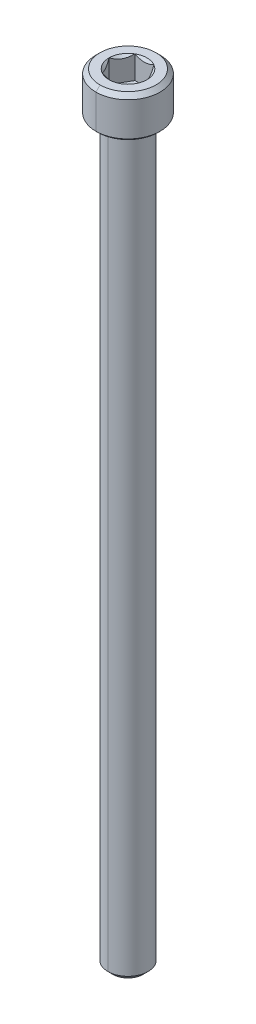
ISO-10303-21;
HEADER;
FILE_DESCRIPTION(('STEP AP214'),'2;1');
FILE_NAME('part.step','',(''),(''),'','','');
FILE_SCHEMA(('AUTOMOTIVE_DESIGN { 1 0 10303 214 1 1 1 1 }'));
ENDSEC;
DATA;
#1=APPLICATION_CONTEXT('core data for automotive mechanical design processes');
#2=APPLICATION_PROTOCOL_DEFINITION('international standard','automotive_design',2000,#1);
#3=PRODUCT_CONTEXT('',#1,'mechanical');
#4=PRODUCT('Part','Part','',(#3));
#5=PRODUCT_RELATED_PRODUCT_CATEGORY('part','',(#4));
#6=PRODUCT_DEFINITION_FORMATION('','',#4);
#7=PRODUCT_DEFINITION_CONTEXT('part definition',#1,'design');
#8=PRODUCT_DEFINITION('design','',#6,#7);
#9=PRODUCT_DEFINITION_SHAPE('','',#8);
#10=(LENGTH_UNIT() NAMED_UNIT(*) SI_UNIT(.MILLI.,.METRE.));
#11=(NAMED_UNIT(*) PLANE_ANGLE_UNIT() SI_UNIT($,.RADIAN.));
#12=(NAMED_UNIT(*) SI_UNIT($,.STERADIAN.) SOLID_ANGLE_UNIT());
#13=UNCERTAINTY_MEASURE_WITH_UNIT(LENGTH_MEASURE(1.E-05),#10,'distance_accuracy_value','');
#14=(GEOMETRIC_REPRESENTATION_CONTEXT(3) GLOBAL_UNCERTAINTY_ASSIGNED_CONTEXT((#13)) GLOBAL_UNIT_ASSIGNED_CONTEXT((#10,
#11,#12)) REPRESENTATION_CONTEXT('',''));
#15=CARTESIAN_POINT('',(0.,0.,0.));
#16=DIRECTION('',(0.,0.,1.));
#17=DIRECTION('',(1.,0.,0.));
#18=AXIS2_PLACEMENT_3D('',#15,#16,#17);
#19=CARTESIAN_POINT('',(0.,-0.152399999999997,0.));
#20=DIRECTION('',(0.,1.,0.));
#21=DIRECTION('',(0.,0.,1.));
#22=AXIS2_PLACEMENT_3D('',#19,#20,#21);
#23=TOROIDAL_SURFACE('',#22,2.5654,0.1524);
#24=CARTESIAN_POINT('',(0.,-0.152399999999997,-2.5654));
#25=DIRECTION('',(1.,0.,0.));
#26=DIRECTION('',(0.,0.,-1.));
#27=AXIS2_PLACEMENT_3D('',#24,#25,#26);
#28=CIRCLE('',#27,0.1524);
#29=CARTESIAN_POINT('',(0.,0.,-2.5654));
#30=VERTEX_POINT('',#29);
#31=CARTESIAN_POINT('',(0.,-0.152399999999997,-2.413));
#32=VERTEX_POINT('',#31);
#33=EDGE_CURVE('E542',#30,#32,#28,.T.);
#34=ORIENTED_EDGE('',*,*,#33,.F.);
#35=CARTESIAN_POINT('',(0.,0.,0.));
#36=DIRECTION('',(0.,1.,0.));
#37=DIRECTION('',(0.,0.,1.));
#38=AXIS2_PLACEMENT_3D('',#35,#36,#37);
#39=CIRCLE('',#38,2.5654);
#40=CARTESIAN_POINT('',(0.,0.,2.5654));
#41=VERTEX_POINT('',#40);
#42=EDGE_CURVE('E543',#41,#30,#39,.T.);
#43=ORIENTED_EDGE('',*,*,#42,.F.);
#44=CARTESIAN_POINT('',(0.,-0.152399999999997,2.5654));
#45=DIRECTION('',(-1.,0.,0.));
#46=DIRECTION('',(0.,0.,1.));
#47=AXIS2_PLACEMENT_3D('',#44,#45,#46);
#48=CIRCLE('',#47,0.1524);
#49=CARTESIAN_POINT('',(0.,-0.152399999999997,2.413));
#50=VERTEX_POINT('',#49);
#51=EDGE_CURVE('E150',#41,#50,#48,.T.);
#52=ORIENTED_EDGE('',*,*,#51,.T.);
#53=CARTESIAN_POINT('',(0.,-0.152399999999997,0.));
#54=DIRECTION('',(0.,-1.,0.));
#55=DIRECTION('',(0.,0.,1.));
#56=AXIS2_PLACEMENT_3D('',#53,#54,#55);
#57=CIRCLE('',#56,2.413);
#58=EDGE_CURVE('E536',#32,#50,#57,.T.);
#59=ORIENTED_EDGE('',*,*,#58,.F.);
#60=EDGE_LOOP('',(#34,#43,#52,#59));
#61=FACE_BOUND('',#60,.T.);
#62=ADVANCED_FACE('F17',(#61),#23,.F.);
#63=CARTESIAN_POINT('',(2.28769270663697,2.032,0.));
#64=DIRECTION('',(0.866025403784439,0.,-0.5));
#65=DIRECTION('',(0.,-1.,0.));
#66=AXIS2_PLACEMENT_3D('',#63,#64,#65);
#67=PLANE('',#66);
#68=DIRECTION('',(0.,1.,0.));
#69=VECTOR('',#68,1.);
#70=CARTESIAN_POINT('',(2.28769270663697,2.032,0.));
#71=LINE('',#70,#69);
#72=CARTESIAN_POINT('',(2.28769270663697,2.032,0.));
#73=VERTEX_POINT('',#72);
#74=CARTESIAN_POINT('',(2.28769270663697,4.826,0.));
#75=VERTEX_POINT('',#74);
#76=EDGE_CURVE('E11',#73,#75,#71,.T.);
#77=ORIENTED_EDGE('',*,*,#76,.T.);
#78=CARTESIAN_POINT('',(2.28769270663697,4.826,0.));
#79=CARTESIAN_POINT('',(2.14317957440595,4.68148686776898,-0.250304087385059));
#80=CARTESIAN_POINT('',(2.01227876614631,4.6063557329633,-0.477030938042588));
#81=CARTESIAN_POINT('',(1.86218187125153,4.52020691391333,-0.737006386058674));
#82=CARTESIAN_POINT('',(1.71787595811445,4.51951177250135,-0.986951559444716));
#83=CARTESIAN_POINT('',(1.5738329827954,4.51881789769698,-1.23644131117069));
#84=CARTESIAN_POINT('',(1.42308868167617,4.6041731544126,-1.49753809966066));
#85=CARTESIAN_POINT('',(1.29072619033411,4.67912016298365,-1.7267966596815));
#86=CARTESIAN_POINT('',(1.14384635331849,4.826,-1.9812));
#87=B_SPLINE_CURVE_WITH_KNOTS('',2,(#78,#79,#80,#81,#82,#83,#84,#85,#86),.UNSPECIFIED.,.F.,.F.,
(3,2,2,2,3),(0.,0.25,0.5,0.75,1.),.UNSPECIFIED.);
#88=CARTESIAN_POINT('',(1.14384635331849,4.826,-1.9812));
#89=VERTEX_POINT('',#88);
#90=EDGE_CURVE('E314',#75,#89,#87,.T.);
#91=ORIENTED_EDGE('',*,*,#90,.T.);
#92=DIRECTION('',(0.,1.,0.));
#93=VECTOR('',#92,1.);
#94=CARTESIAN_POINT('',(1.14384635331849,2.032,-1.9812));
#95=LINE('',#94,#93);
#96=CARTESIAN_POINT('',(1.14384635331849,2.032,-1.9812));
#97=VERTEX_POINT('',#96);
#98=EDGE_CURVE('E223',#97,#89,#95,.T.);
#99=ORIENTED_EDGE('',*,*,#98,.F.);
#100=DIRECTION('',(-0.5,0.,-0.866025403784439));
#101=VECTOR('',#100,1.);
#102=CARTESIAN_POINT('',(2.28769270663697,2.032,0.));
#103=LINE('',#102,#101);
#104=EDGE_CURVE('E517',#73,#97,#103,.T.);
#105=ORIENTED_EDGE('',*,*,#104,.F.);
#106=EDGE_LOOP('',(#77,#91,#99,#105));
#107=FACE_BOUND('',#106,.T.);
#108=ADVANCED_FACE('F319',(#107),#67,.F.);
#109=CARTESIAN_POINT('',(1.14384635331849,2.032,1.9812));
#110=DIRECTION('',(0.866025403784439,0.,0.5));
#111=DIRECTION('',(0.,-1.,0.));
#112=AXIS2_PLACEMENT_3D('',#109,#110,#111);
#113=PLANE('',#112);
#114=DIRECTION('',(0.,1.,0.));
#115=VECTOR('',#114,1.);
#116=CARTESIAN_POINT('',(1.14384635331849,2.032,1.9812));
#117=LINE('',#116,#115);
#118=CARTESIAN_POINT('',(1.14384635331849,2.032,1.9812));
#119=VERTEX_POINT('',#118);
#120=CARTESIAN_POINT('',(1.14384635331849,4.826,1.9812));
#121=VERTEX_POINT('',#120);
#122=EDGE_CURVE('E31',#119,#121,#117,.T.);
#123=ORIENTED_EDGE('',*,*,#122,.T.);
#124=CARTESIAN_POINT('',(1.14384635331849,4.826,1.9812));
#125=CARTESIAN_POINT('',(1.28835948554838,4.6814868677701,1.7308959126169));
#126=CARTESIAN_POINT('',(1.41926029380915,4.60635573296329,1.50416906195741));
#127=CARTESIAN_POINT('',(1.56935718870215,4.5202069139138,1.24419361394442));
#128=CARTESIAN_POINT('',(1.71366310184101,4.51951177250135,0.994248440555283));
#129=CARTESIAN_POINT('',(1.85770607715928,4.51881789769651,0.744758688830662));
#130=CARTESIAN_POINT('',(2.00845037827929,4.6041731544126,0.48366190033934));
#131=CARTESIAN_POINT('',(2.14081286962138,4.67912016298368,0.254403340318435));
#132=CARTESIAN_POINT('',(2.28769270663697,4.826,0.));
#133=B_SPLINE_CURVE_WITH_KNOTS('',2,(#124,#125,#126,#127,#128,#129,#130,#131,#132),
.UNSPECIFIED.,.F.,.F.,(3,2,2,2,3),(0.,0.25,0.5,0.75,1.),.UNSPECIFIED.);
#134=EDGE_CURVE('E133',#121,#75,#133,.T.);
#135=ORIENTED_EDGE('',*,*,#134,.T.);
#136=ORIENTED_EDGE('',*,*,#76,.F.);
#137=DIRECTION('',(0.5,0.,-0.866025403784439));
#138=VECTOR('',#137,1.);
#139=CARTESIAN_POINT('',(1.14384635331849,2.032,1.9812));
#140=LINE('',#139,#138);
#141=EDGE_CURVE('E521',#119,#73,#140,.T.);
#142=ORIENTED_EDGE('',*,*,#141,.F.);
#143=EDGE_LOOP('',(#123,#135,#136,#142));
#144=FACE_BOUND('',#143,.T.);
#145=ADVANCED_FACE('F166',(#144),#113,.F.);
#146=CARTESIAN_POINT('',(-1.14384635331848,2.032,1.9812));
#147=DIRECTION('',(0.,0.,1.));
#148=DIRECTION('',(1.,0.,0.));
#149=AXIS2_PLACEMENT_3D('',#146,#147,#148);
#150=PLANE('',#149);
#151=DIRECTION('',(0.,1.,0.));
#152=VECTOR('',#151,1.);
#153=CARTESIAN_POINT('',(-1.14384635331848,2.032,1.9812));
#154=LINE('',#153,#152);
#155=CARTESIAN_POINT('',(-1.14384635331848,2.032,1.9812));
#156=VERTEX_POINT('',#155);
#157=CARTESIAN_POINT('',(-1.14384635331848,4.826,1.9812));
#158=VERTEX_POINT('',#157);
#159=EDGE_CURVE('E127',#156,#158,#154,.T.);
#160=ORIENTED_EDGE('',*,*,#159,.T.);
#161=CARTESIAN_POINT('',(-1.14384635331848,4.826,1.9812));
#162=CARTESIAN_POINT('',(-0.852604529161856,4.68037908792168,1.9812));
#163=CARTESIAN_POINT('',(-0.58892975472875,4.6051869937822,1.9812));
#164=CARTESIAN_POINT('',(-0.288478278545423,4.51950729336303,1.9812));
#165=CARTESIAN_POINT('',(0.,4.51950729336303,1.9812));
#166=B_SPLINE_CURVE_WITH_KNOTS('',2,(#161,#162,#163,#164,#165),.UNSPECIFIED.,.F.,.F.,(3,2,3),
(0.,0.5,1.),.UNSPECIFIED.);
#167=CARTESIAN_POINT('',(0.,4.51950729336303,1.9812));
#168=VERTEX_POINT('',#167);
#169=EDGE_CURVE('E119',#158,#168,#166,.T.);
#170=ORIENTED_EDGE('',*,*,#169,.T.);
#171=CARTESIAN_POINT('',(0.,4.51950729336303,1.9812));
#172=CARTESIAN_POINT('',(0.287946815411568,4.51950729336303,1.9812));
#173=CARTESIAN_POINT('',(0.588849780232636,4.60516420753973,1.9812));
#174=CARTESIAN_POINT('',(0.851987770474281,4.68007070857789,1.9812));
#175=CARTESIAN_POINT('',(1.14384635331849,4.826,1.9812));
#176=B_SPLINE_CURVE_WITH_KNOTS('',2,(#171,#172,#173,#174,#175),.UNSPECIFIED.,.F.,.F.,(3,2,3),
(0.,0.5,1.),.UNSPECIFIED.);
#177=EDGE_CURVE('E124',#168,#121,#176,.T.);
#178=ORIENTED_EDGE('',*,*,#177,.T.);
#179=ORIENTED_EDGE('',*,*,#122,.F.);
#180=DIRECTION('',(1.,0.,0.));
#181=VECTOR('',#180,1.);
#182=CARTESIAN_POINT('',(-1.14384635331848,2.032,1.9812));
#183=LINE('',#182,#181);
#184=EDGE_CURVE('E507',#156,#119,#183,.T.);
#185=ORIENTED_EDGE('',*,*,#184,.F.);
#186=EDGE_LOOP('',(#160,#170,#178,#179,#185));
#187=FACE_BOUND('',#186,.T.);
#188=ADVANCED_FACE('F122',(#187),#150,.F.);
#189=CARTESIAN_POINT('',(-2.28769270663697,2.032,0.));
#190=DIRECTION('',(-0.866025403784438,0.,0.5));
#191=DIRECTION('',(0.,1.,0.));
#192=AXIS2_PLACEMENT_3D('',#189,#190,#191);
#193=PLANE('',#192);
#194=DIRECTION('',(0.,1.,0.));
#195=VECTOR('',#194,1.);
#196=CARTESIAN_POINT('',(-2.28769270663697,2.032,0.));
#197=LINE('',#196,#195);
#198=CARTESIAN_POINT('',(-2.28769270663697,2.032,0.));
#199=VERTEX_POINT('',#198);
#200=CARTESIAN_POINT('',(-2.28769270663697,4.826,0.));
#201=VERTEX_POINT('',#200);
#202=EDGE_CURVE('E222',#199,#201,#197,.T.);
#203=ORIENTED_EDGE('',*,*,#202,.T.);
#204=CARTESIAN_POINT('',(-2.28769270663697,4.826,0.));
#205=CARTESIAN_POINT('',(-2.14317957440604,4.68148686776907,0.250304087384906));
#206=CARTESIAN_POINT('',(-2.01227876614631,4.6063557329633,0.477030938042588));
#207=CARTESIAN_POINT('',(-1.8621818712512,4.5202069139131,0.737006386059238));
#208=CARTESIAN_POINT('',(-1.71787595811445,4.51951177250135,0.986951559444715));
#209=CARTESIAN_POINT('',(-1.57383298279637,4.51881789769721,1.23644131116902));
#210=CARTESIAN_POINT('',(-1.42308868167617,4.6041731544126,1.49753809966066));
#211=CARTESIAN_POINT('',(-1.2907261903357,4.67912016298207,1.72679665967875));
#212=CARTESIAN_POINT('',(-1.14384635331849,4.826,1.9812));
#213=B_SPLINE_CURVE_WITH_KNOTS('',2,(#204,#205,#206,#207,#208,#209,#210,#211,#212),
.UNSPECIFIED.,.F.,.F.,(3,2,2,2,3),(0.,0.25,0.5,0.75,1.),.UNSPECIFIED.);
#214=EDGE_CURVE('E134',#201,#158,#213,.T.);
#215=ORIENTED_EDGE('',*,*,#214,.T.);
#216=ORIENTED_EDGE('',*,*,#159,.F.);
#217=DIRECTION('',(0.5,0.,0.866025403784439));
#218=VECTOR('',#217,1.);
#219=CARTESIAN_POINT('',(-2.28769270663697,2.032,0.));
#220=LINE('',#219,#218);
#221=EDGE_CURVE('E503',#199,#156,#220,.T.);
#222=ORIENTED_EDGE('',*,*,#221,.F.);
#223=EDGE_LOOP('',(#203,#215,#216,#222));
#224=FACE_BOUND('',#223,.T.);
#225=ADVANCED_FACE('F165',(#224),#193,.F.);
#226=CARTESIAN_POINT('',(-1.14384635331849,2.032,-1.9812));
#227=DIRECTION('',(-0.866025403784439,0.,-0.5));
#228=DIRECTION('',(-0.5,0.,0.866025403784439));
#229=AXIS2_PLACEMENT_3D('',#226,#227,#228);
#230=PLANE('',#229);
#231=DIRECTION('',(0.,1.,0.));
#232=VECTOR('',#231,1.);
#233=CARTESIAN_POINT('',(-1.14384635331849,2.032,-1.9812));
#234=LINE('',#233,#232);
#235=CARTESIAN_POINT('',(-1.14384635331849,2.032,-1.9812));
#236=VERTEX_POINT('',#235);
#237=CARTESIAN_POINT('',(-1.14384635331849,4.826,-1.9812));
#238=VERTEX_POINT('',#237);
#239=EDGE_CURVE('E213',#236,#238,#234,.T.);
#240=ORIENTED_EDGE('',*,*,#239,.T.);
#241=CARTESIAN_POINT('',(-1.14384635331849,4.826,-1.9812));
#242=CARTESIAN_POINT('',(-1.28835948554886,4.68148686776963,-1.73089591261607));
#243=CARTESIAN_POINT('',(-1.41926029380915,4.6063557329633,-1.50416906195741));
#244=CARTESIAN_POINT('',(-1.56935718870378,4.5202069139131,-1.24419361394159));
#245=CARTESIAN_POINT('',(-1.71366310184101,4.51951177250136,-0.994248440555283));
#246=CARTESIAN_POINT('',(-1.85770607715962,4.51881789769721,-0.744758688830066));
#247=CARTESIAN_POINT('',(-2.00845037827929,4.6041731544126,-0.48366190033934));
#248=CARTESIAN_POINT('',(-2.14081286962037,4.67912016298268,-0.254403340320189));
#249=CARTESIAN_POINT('',(-2.28769270663697,4.826,0.));
#250=B_SPLINE_CURVE_WITH_KNOTS('',2,(#241,#242,#243,#244,#245,#246,#247,#248,#249),
.UNSPECIFIED.,.F.,.F.,(3,2,2,2,3),(0.,0.25,0.5,0.75,1.),.UNSPECIFIED.);
#251=EDGE_CURVE('E346',#238,#201,#250,.T.);
#252=ORIENTED_EDGE('',*,*,#251,.T.);
#253=ORIENTED_EDGE('',*,*,#202,.F.);
#254=DIRECTION('',(-0.5,0.,0.866025403784439));
#255=VECTOR('',#254,1.);
#256=CARTESIAN_POINT('',(-1.14384635331849,2.032,-1.9812));
#257=LINE('',#256,#255);
#258=EDGE_CURVE('E500',#236,#199,#257,.T.);
#259=ORIENTED_EDGE('',*,*,#258,.F.);
#260=EDGE_LOOP('',(#240,#252,#253,#259));
#261=FACE_BOUND('',#260,.T.);
#262=ADVANCED_FACE('F328',(#261),#230,.F.);
#263=CARTESIAN_POINT('',(1.14384635331849,2.032,-1.9812));
#264=DIRECTION('',(0.,0.,-1.));
#265=DIRECTION('',(0.,-1.,0.));
#266=AXIS2_PLACEMENT_3D('',#263,#264,#265);
#267=PLANE('',#266);
#268=ORIENTED_EDGE('',*,*,#98,.T.);
#269=CARTESIAN_POINT('',(1.14384635331849,4.826,-1.9812));
#270=CARTESIAN_POINT('',(0.852681268449242,4.68041745756538,-1.9812));
#271=CARTESIAN_POINT('',(0.589071853179802,4.60522748732522,-1.9812));
#272=CARTESIAN_POINT('',(0.289065178881829,4.51965583621686,-1.9812));
#273=CARTESIAN_POINT('',(0.000466056341207922,4.51950734818044,-1.9812));
#274=CARTESIAN_POINT('',(-0.28735920168427,4.51935925830747,-1.9812));
#275=CARTESIAN_POINT('',(-0.588708500274589,4.60512396116295,-1.9812));
#276=CARTESIAN_POINT('',(-0.851909486810259,4.68003156674588,-1.9812));
#277=CARTESIAN_POINT('',(-1.14384635331849,4.826,-1.9812));
#278=B_SPLINE_CURVE_WITH_KNOTS('',2,(#269,#270,#271,#272,#273,#274,#275,#276,#277),
.UNSPECIFIED.,.F.,.F.,(3,2,2,2,3),(0.,0.25,0.5,0.75,1.),.UNSPECIFIED.);
#279=EDGE_CURVE('E233',#89,#238,#278,.T.);
#280=ORIENTED_EDGE('',*,*,#279,.T.);
#281=ORIENTED_EDGE('',*,*,#239,.F.);
#282=DIRECTION('',(-1.,0.,0.));
#283=VECTOR('',#282,1.);
#284=CARTESIAN_POINT('',(1.14384635331849,2.032,-1.9812));
#285=LINE('',#284,#283);
#286=EDGE_CURVE('E511',#97,#236,#285,.T.);
#287=ORIENTED_EDGE('',*,*,#286,.F.);
#288=EDGE_LOOP('',(#268,#280,#281,#287));
#289=FACE_BOUND('',#288,.T.);
#290=ADVANCED_FACE('F168',(#289),#267,.F.);
#291=CARTESIAN_POINT('',(0.,2.032,0.));
#292=DIRECTION('',(0.,1.,0.));
#293=DIRECTION('',(1.,0.,0.));
#294=AXIS2_PLACEMENT_3D('',#291,#292,#293);
#295=PLANE('',#294);
#296=ORIENTED_EDGE('',*,*,#104,.T.);
#297=ORIENTED_EDGE('',*,*,#286,.T.);
#298=ORIENTED_EDGE('',*,*,#258,.T.);
#299=ORIENTED_EDGE('',*,*,#221,.T.);
#300=ORIENTED_EDGE('',*,*,#184,.T.);
#301=ORIENTED_EDGE('',*,*,#141,.T.);
#302=EDGE_LOOP('',(#296,#297,#298,#299,#300,#301));
#303=FACE_BOUND('',#302,.T.);
#304=ADVANCED_FACE('F510',(#303),#295,.T.);
#305=CARTESIAN_POINT('',(0.,4.826,0.));
#306=DIRECTION('',(0.,1.,0.));
#307=DIRECTION('',(0.,0.,1.));
#308=AXIS2_PLACEMENT_3D('',#305,#306,#307);
#309=CONICAL_SURFACE('',#308,2.28769270663697,0.78539816339745);
#310=CARTESIAN_POINT('',(0.,4.826,0.));
#311=DIRECTION('',(0.,1.,0.));
#312=DIRECTION('',(0.,0.,1.));
#313=AXIS2_PLACEMENT_3D('',#310,#311,#312);
#314=CIRCLE('',#313,2.28769270663697);
#315=EDGE_CURVE('E556',#75,#89,#314,.T.);
#316=ORIENTED_EDGE('',*,*,#315,.T.);
#317=ORIENTED_EDGE('',*,*,#90,.F.);
#318=EDGE_LOOP('',(#316,#317));
#319=FACE_BOUND('',#318,.T.);
#320=ADVANCED_FACE('F19',(#319),#309,.F.);
#321=CARTESIAN_POINT('',(0.,4.826,0.));
#322=DIRECTION('',(0.,1.,0.));
#323=DIRECTION('',(0.,0.,1.));
#324=AXIS2_PLACEMENT_3D('',#321,#322,#323);
#325=CONICAL_SURFACE('',#324,2.28769270663697,0.78539816339745);
#326=CARTESIAN_POINT('',(0.,4.826,0.));
#327=DIRECTION('',(0.,1.,0.));
#328=DIRECTION('',(0.,0.,1.));
#329=AXIS2_PLACEMENT_3D('',#326,#327,#328);
#330=CIRCLE('',#329,2.28769270663697);
#331=EDGE_CURVE('E436',#121,#75,#330,.T.);
#332=ORIENTED_EDGE('',*,*,#331,.T.);
#333=ORIENTED_EDGE('',*,*,#134,.F.);
#334=EDGE_LOOP('',(#332,#333));
#335=FACE_BOUND('',#334,.T.);
#336=ADVANCED_FACE('F195',(#335),#325,.F.);
#337=CARTESIAN_POINT('',(0.,4.826,0.));
#338=DIRECTION('',(0.,1.,0.));
#339=DIRECTION('',(0.,0.,1.));
#340=AXIS2_PLACEMENT_3D('',#337,#338,#339);
#341=CONICAL_SURFACE('',#340,2.28769270663697,0.78539816339745);
#342=DIRECTION('',(0.,0.707106781186546,0.707106781186549));
#343=VECTOR('',#342,1.);
#344=CARTESIAN_POINT('',(0.,4.826,2.28769270663697));
#345=LINE('',#344,#343);
#346=CARTESIAN_POINT('',(0.,4.826,2.28769270663697));
#347=VERTEX_POINT('',#346);
#348=EDGE_CURVE('E138',#168,#347,#345,.T.);
#349=ORIENTED_EDGE('',*,*,#348,.F.);
#350=ORIENTED_EDGE('',*,*,#169,.F.);
#351=CARTESIAN_POINT('',(0.,4.826,0.));
#352=DIRECTION('',(0.,1.,0.));
#353=DIRECTION('',(0.,0.,1.));
#354=AXIS2_PLACEMENT_3D('',#351,#352,#353);
#355=CIRCLE('',#354,2.28769270663697);
#356=EDGE_CURVE('E141',#158,#347,#355,.T.);
#357=ORIENTED_EDGE('',*,*,#356,.T.);
#358=EDGE_LOOP('',(#349,#350,#357));
#359=FACE_BOUND('',#358,.T.);
#360=ADVANCED_FACE('F139',(#359),#341,.F.);
#361=CARTESIAN_POINT('',(0.,4.826,0.));
#362=DIRECTION('',(0.,1.,0.));
#363=DIRECTION('',(0.,0.,1.));
#364=AXIS2_PLACEMENT_3D('',#361,#362,#363);
#365=CONICAL_SURFACE('',#364,2.28769270663697,0.78539816339745);
#366=CARTESIAN_POINT('',(0.,4.826,0.));
#367=DIRECTION('',(0.,1.,0.));
#368=DIRECTION('',(0.,0.,1.));
#369=AXIS2_PLACEMENT_3D('',#366,#367,#368);
#370=CIRCLE('',#369,2.28769270663697);
#371=EDGE_CURVE('E354',#201,#158,#370,.T.);
#372=ORIENTED_EDGE('',*,*,#371,.T.);
#373=ORIENTED_EDGE('',*,*,#214,.F.);
#374=EDGE_LOOP('',(#372,#373));
#375=FACE_BOUND('',#374,.T.);
#376=ADVANCED_FACE('F194',(#375),#365,.F.);
#377=CARTESIAN_POINT('',(0.,4.826,0.));
#378=DIRECTION('',(0.,1.,0.));
#379=DIRECTION('',(0.,0.,1.));
#380=AXIS2_PLACEMENT_3D('',#377,#378,#379);
#381=CONICAL_SURFACE('',#380,2.28769270663697,0.78539816339745);
#382=CARTESIAN_POINT('',(0.,4.826,0.));
#383=DIRECTION('',(0.,1.,0.));
#384=DIRECTION('',(0.,0.,1.));
#385=AXIS2_PLACEMENT_3D('',#382,#383,#384);
#386=CIRCLE('',#385,2.28769270663697);
#387=EDGE_CURVE('E350',#238,#201,#386,.T.);
#388=ORIENTED_EDGE('',*,*,#387,.T.);
#389=ORIENTED_EDGE('',*,*,#251,.F.);
#390=EDGE_LOOP('',(#388,#389));
#391=FACE_BOUND('',#390,.T.);
#392=ADVANCED_FACE('F198',(#391),#381,.F.);
#393=CARTESIAN_POINT('',(0.,4.826,0.));
#394=DIRECTION('',(0.,1.,0.));
#395=DIRECTION('',(0.,0.,1.));
#396=AXIS2_PLACEMENT_3D('',#393,#394,#395);
#397=CONICAL_SURFACE('',#396,2.28769270663697,0.78539816339745);
#398=CARTESIAN_POINT('',(0.,4.826,0.));
#399=DIRECTION('',(0.,1.,0.));
#400=DIRECTION('',(0.,0.,1.));
#401=AXIS2_PLACEMENT_3D('',#398,#399,#400);
#402=CIRCLE('',#401,2.28769270663697);
#403=EDGE_CURVE('E353',#89,#238,#402,.T.);
#404=ORIENTED_EDGE('',*,*,#403,.T.);
#405=ORIENTED_EDGE('',*,*,#279,.F.);
#406=EDGE_LOOP('',(#404,#405));
#407=FACE_BOUND('',#406,.T.);
#408=ADVANCED_FACE('F202',(#407),#397,.F.);
#409=CARTESIAN_POINT('',(0.,0.22860000000002,0.));
#410=DIRECTION('',(0.,1.,0.));
#411=DIRECTION('',(0.,0.,1.));
#412=AXIS2_PLACEMENT_3D('',#409,#410,#411);
#413=CONICAL_SURFACE('',#412,3.8735,0.785398163397419);
#414=DIRECTION('',(0.,0.707106781186568,-0.707106781186527));
#415=VECTOR('',#414,1.);
#416=CARTESIAN_POINT('',(0.,0.22860000000002,-3.8735));
#417=LINE('',#416,#415);
#418=CARTESIAN_POINT('',(0.,0.,-3.6449));
#419=VERTEX_POINT('',#418);
#420=CARTESIAN_POINT('',(0.,0.22860000000002,-3.8735));
#421=VERTEX_POINT('',#420);
#422=EDGE_CURVE('E287',#419,#421,#417,.T.);
#423=ORIENTED_EDGE('',*,*,#422,.F.);
#424=CARTESIAN_POINT('',(0.,0.,0.));
#425=DIRECTION('',(0.,-1.,0.));
#426=DIRECTION('',(0.,0.,1.));
#427=AXIS2_PLACEMENT_3D('',#424,#425,#426);
#428=CIRCLE('',#427,3.6449);
#429=CARTESIAN_POINT('',(0.,0.,3.6449));
#430=VERTEX_POINT('',#429);
#431=EDGE_CURVE('E546',#430,#419,#428,.T.);
#432=ORIENTED_EDGE('',*,*,#431,.F.);
#433=DIRECTION('',(0.,0.707106781186568,0.707106781186527));
#434=VECTOR('',#433,1.);
#435=CARTESIAN_POINT('',(0.,0.22860000000002,3.8735));
#436=LINE('',#435,#434);
#437=CARTESIAN_POINT('',(0.,0.22860000000002,3.8735));
#438=VERTEX_POINT('',#437);
#439=EDGE_CURVE('E527',#430,#438,#436,.T.);
#440=ORIENTED_EDGE('',*,*,#439,.T.);
#441=CARTESIAN_POINT('',(0.,0.22860000000002,0.));
#442=DIRECTION('',(0.,1.,0.));
#443=DIRECTION('',(0.,0.,1.));
#444=AXIS2_PLACEMENT_3D('',#441,#442,#443);
#445=CIRCLE('',#444,3.8735);
#446=EDGE_CURVE('E577',#421,#438,#445,.T.);
#447=ORIENTED_EDGE('',*,*,#446,.F.);
#448=EDGE_LOOP('',(#423,#432,#440,#447));
#449=FACE_BOUND('',#448,.T.);
#450=ADVANCED_FACE('F257',(#449),#413,.T.);
#451=CARTESIAN_POINT('',(0.,4.826,0.));
#452=DIRECTION('',(0.,-1.,0.));
#453=DIRECTION('',(0.,0.,-1.));
#454=AXIS2_PLACEMENT_3D('',#451,#452,#453);
#455=CONICAL_SURFACE('',#454,3.3735,0.785398163397462);
#456=DIRECTION('',(0.,-0.707106781186538,0.707106781186557));
#457=VECTOR('',#456,1.);
#458=CARTESIAN_POINT('',(0.,4.826,3.3735));
#459=LINE('',#458,#457);
#460=CARTESIAN_POINT('',(0.,4.826,3.3735));
#461=VERTEX_POINT('',#460);
#462=CARTESIAN_POINT('',(0.,4.326,3.8735));
#463=VERTEX_POINT('',#462);
#464=EDGE_CURVE('E568',#461,#463,#459,.T.);
#465=ORIENTED_EDGE('',*,*,#464,.F.);
#466=CARTESIAN_POINT('',(0.,4.826,0.));
#467=DIRECTION('',(0.,1.,0.));
#468=DIRECTION('',(0.,0.,1.));
#469=AXIS2_PLACEMENT_3D('',#466,#467,#468);
#470=CIRCLE('',#469,3.3735);
#471=CARTESIAN_POINT('',(0.,4.826,-3.3735));
#472=VERTEX_POINT('',#471);
#473=EDGE_CURVE('E581',#472,#461,#470,.T.);
#474=ORIENTED_EDGE('',*,*,#473,.F.);
#475=DIRECTION('',(0.,-0.707106781186538,-0.707106781186557));
#476=VECTOR('',#475,1.);
#477=CARTESIAN_POINT('',(0.,4.826,-3.3735));
#478=LINE('',#477,#476);
#479=CARTESIAN_POINT('',(0.,4.326,-3.8735));
#480=VERTEX_POINT('',#479);
#481=EDGE_CURVE('E526',#472,#480,#478,.T.);
#482=ORIENTED_EDGE('',*,*,#481,.T.);
#483=CARTESIAN_POINT('',(0.,4.326,0.));
#484=DIRECTION('',(0.,-1.,0.));
#485=DIRECTION('',(0.,0.,1.));
#486=AXIS2_PLACEMENT_3D('',#483,#484,#485);
#487=CIRCLE('',#486,3.8735);
#488=EDGE_CURVE('E88',#463,#480,#487,.T.);
#489=ORIENTED_EDGE('',*,*,#488,.F.);
#490=EDGE_LOOP('',(#465,#474,#482,#489));
#491=FACE_BOUND('',#490,.T.);
#492=ADVANCED_FACE('F167',(#491),#455,.T.);
#493=CARTESIAN_POINT('',(0.,0.,0.));
#494=DIRECTION('',(0.,1.,0.));
#495=DIRECTION('',(1.,0.,0.));
#496=AXIS2_PLACEMENT_3D('',#493,#494,#495);
#497=PLANE('',#496);
#498=ORIENTED_EDGE('',*,*,#42,.T.);
#499=CARTESIAN_POINT('',(0.,0.,0.));
#500=DIRECTION('',(0.,1.,0.));
#501=DIRECTION('',(0.,0.,1.));
#502=AXIS2_PLACEMENT_3D('',#499,#500,#501);
#503=CIRCLE('',#502,2.5654);
#504=EDGE_CURVE('E538',#30,#41,#503,.T.);
#505=ORIENTED_EDGE('',*,*,#504,.T.);
#506=EDGE_LOOP('',(#498,#505));
#507=FACE_BOUND('',#506,.T.);
#508=ORIENTED_EDGE('',*,*,#431,.T.);
#509=CARTESIAN_POINT('',(0.,0.,0.));
#510=DIRECTION('',(0.,-1.,0.));
#511=DIRECTION('',(0.,0.,1.));
#512=AXIS2_PLACEMENT_3D('',#509,#510,#511);
#513=CIRCLE('',#512,3.6449);
#514=EDGE_CURVE('E280',#419,#430,#513,.T.);
#515=ORIENTED_EDGE('',*,*,#514,.T.);
#516=EDGE_LOOP('',(#508,#515));
#517=FACE_BOUND('',#516,.T.);
#518=ADVANCED_FACE('F258',(#507,#517),#497,.F.);
#519=CARTESIAN_POINT('',(0.,4.826,0.));
#520=DIRECTION('',(0.,1.,0.));
#521=DIRECTION('',(1.,0.,0.));
#522=AXIS2_PLACEMENT_3D('',#519,#520,#521);
#523=PLANE('',#522);
#524=ORIENTED_EDGE('',*,*,#331,.F.);
#525=CARTESIAN_POINT('',(0.,4.826,0.));
#526=DIRECTION('',(0.,1.,0.));
#527=DIRECTION('',(0.,0.,1.));
#528=AXIS2_PLACEMENT_3D('',#525,#526,#527);
#529=CIRCLE('',#528,2.28769270663697);
#530=EDGE_CURVE('E146',#347,#121,#529,.T.);
#531=ORIENTED_EDGE('',*,*,#530,.F.);
#532=ORIENTED_EDGE('',*,*,#356,.F.);
#533=ORIENTED_EDGE('',*,*,#371,.F.);
#534=ORIENTED_EDGE('',*,*,#387,.F.);
#535=ORIENTED_EDGE('',*,*,#403,.F.);
#536=ORIENTED_EDGE('',*,*,#315,.F.);
#537=EDGE_LOOP('',(#524,#531,#532,#533,#534,#535,#536));
#538=FACE_BOUND('',#537,.T.);
#539=ORIENTED_EDGE('',*,*,#473,.T.);
#540=CARTESIAN_POINT('',(0.,4.826,0.));
#541=DIRECTION('',(0.,1.,0.));
#542=DIRECTION('',(0.,0.,1.));
#543=AXIS2_PLACEMENT_3D('',#540,#541,#542);
#544=CIRCLE('',#543,3.3735);
#545=EDGE_CURVE('E531',#461,#472,#544,.T.);
#546=ORIENTED_EDGE('',*,*,#545,.T.);
#547=EDGE_LOOP('',(#539,#546));
#548=FACE_BOUND('',#547,.T.);
#549=ADVANCED_FACE('F381',(#538,#548),#523,.T.);
#550=CARTESIAN_POINT('',(0.,4.826,0.));
#551=DIRECTION('',(0.,-1.,0.));
#552=DIRECTION('',(0.,0.,-1.));
#553=AXIS2_PLACEMENT_3D('',#550,#551,#552);
#554=CYLINDRICAL_SURFACE('',#553,3.8735);
#555=DIRECTION('',(0.,-1.,0.));
#556=VECTOR('',#555,1.);
#557=CARTESIAN_POINT('',(0.,4.826,3.8735));
#558=LINE('',#557,#556);
#559=EDGE_CURVE('E304',#463,#438,#558,.T.);
#560=ORIENTED_EDGE('',*,*,#559,.F.);
#561=ORIENTED_EDGE('',*,*,#488,.T.);
#562=DIRECTION('',(0.,-1.,0.));
#563=VECTOR('',#562,1.);
#564=CARTESIAN_POINT('',(0.,4.826,-3.8735));
#565=LINE('',#564,#563);
#566=EDGE_CURVE('E300',#480,#421,#565,.T.);
#567=ORIENTED_EDGE('',*,*,#566,.T.);
#568=ORIENTED_EDGE('',*,*,#446,.T.);
#569=EDGE_LOOP('',(#560,#561,#567,#568));
#570=FACE_BOUND('',#569,.T.);
#571=ADVANCED_FACE('F383',(#570),#554,.T.);
#572=CARTESIAN_POINT('',(0.,-88.3158,0.));
#573=DIRECTION('',(0.,1.,0.));
#574=DIRECTION('',(0.,0.,1.));
#575=AXIS2_PLACEMENT_3D('',#572,#573,#574);
#576=CONICAL_SURFACE('',#575,2.413,0.785398163397443);
#577=DIRECTION('',(0.,0.707106781186551,-0.707106781186544));
#578=VECTOR('',#577,1.);
#579=CARTESIAN_POINT('',(0.,-88.3158,-2.413));
#580=LINE('',#579,#578);
#581=CARTESIAN_POINT('',(0.,-88.9,-1.8288));
#582=VERTEX_POINT('',#581);
#583=CARTESIAN_POINT('',(0.,-88.3158,-2.413));
#584=VERTEX_POINT('',#583);
#585=EDGE_CURVE('E308',#582,#584,#580,.T.);
#586=ORIENTED_EDGE('',*,*,#585,.F.);
#587=CARTESIAN_POINT('',(0.,-88.9,0.));
#588=DIRECTION('',(0.,-1.,0.));
#589=DIRECTION('',(0.,0.,1.));
#590=AXIS2_PLACEMENT_3D('',#587,#588,#589);
#591=CIRCLE('',#590,1.8288);
#592=CARTESIAN_POINT('',(0.,-88.9,1.8288));
#593=VERTEX_POINT('',#592);
#594=EDGE_CURVE('E573',#593,#582,#591,.T.);
#595=ORIENTED_EDGE('',*,*,#594,.F.);
#596=DIRECTION('',(0.,0.707106781186551,0.707106781186544));
#597=VECTOR('',#596,1.);
#598=CARTESIAN_POINT('',(0.,-88.3158,2.413));
#599=LINE('',#598,#597);
#600=CARTESIAN_POINT('',(0.,-88.3158,2.413));
#601=VERTEX_POINT('',#600);
#602=EDGE_CURVE('E537',#593,#601,#599,.T.);
#603=ORIENTED_EDGE('',*,*,#602,.T.);
#604=CARTESIAN_POINT('',(0.,-88.3158,0.));
#605=DIRECTION('',(0.,1.,0.));
#606=DIRECTION('',(0.,0.,1.));
#607=AXIS2_PLACEMENT_3D('',#604,#605,#606);
#608=CIRCLE('',#607,2.413);
#609=EDGE_CURVE('E575',#584,#601,#608,.T.);
#610=ORIENTED_EDGE('',*,*,#609,.F.);
#611=EDGE_LOOP('',(#586,#595,#603,#610));
#612=FACE_BOUND('',#611,.T.);
#613=ADVANCED_FACE('F391',(#612),#576,.T.);
#614=CARTESIAN_POINT('',(0.,-88.9,0.));
#615=DIRECTION('',(0.,1.,0.));
#616=DIRECTION('',(1.,0.,0.));
#617=AXIS2_PLACEMENT_3D('',#614,#615,#616);
#618=PLANE('',#617);
#619=ORIENTED_EDGE('',*,*,#594,.T.);
#620=CARTESIAN_POINT('',(0.,-88.9,0.));
#621=DIRECTION('',(0.,-1.,0.));
#622=DIRECTION('',(0.,0.,1.));
#623=AXIS2_PLACEMENT_3D('',#620,#621,#622);
#624=CIRCLE('',#623,1.8288);
#625=EDGE_CURVE('E303',#582,#593,#624,.T.);
#626=ORIENTED_EDGE('',*,*,#625,.T.);
#627=EDGE_LOOP('',(#619,#626));
#628=FACE_BOUND('',#627,.T.);
#629=ADVANCED_FACE('F843',(#628),#618,.F.);
#630=CARTESIAN_POINT('',(0.,-88.9,0.));
#631=DIRECTION('',(0.,1.,0.));
#632=DIRECTION('',(0.,0.,1.));
#633=AXIS2_PLACEMENT_3D('',#630,#631,#632);
#634=CYLINDRICAL_SURFACE('',#633,2.413);
#635=DIRECTION('',(0.,1.,0.));
#636=VECTOR('',#635,1.);
#637=CARTESIAN_POINT('',(0.,-88.9,-2.413));
#638=LINE('',#637,#636);
#639=EDGE_CURVE('E532',#584,#32,#638,.T.);
#640=ORIENTED_EDGE('',*,*,#639,.F.);
#641=ORIENTED_EDGE('',*,*,#609,.T.);
#642=DIRECTION('',(0.,1.,0.));
#643=VECTOR('',#642,1.);
#644=CARTESIAN_POINT('',(0.,-88.9,2.413));
#645=LINE('',#644,#643);
#646=EDGE_CURVE('E564',#601,#50,#645,.T.);
#647=ORIENTED_EDGE('',*,*,#646,.T.);
#648=CARTESIAN_POINT('',(0.,-0.152399999999997,0.));
#649=DIRECTION('',(0.,-1.,0.));
#650=DIRECTION('',(0.,0.,1.));
#651=AXIS2_PLACEMENT_3D('',#648,#649,#650);
#652=CIRCLE('',#651,2.413);
#653=EDGE_CURVE('E553',#50,#32,#652,.T.);
#654=ORIENTED_EDGE('',*,*,#653,.T.);
#655=EDGE_LOOP('',(#640,#641,#647,#654));
#656=FACE_BOUND('',#655,.T.);
#657=ADVANCED_FACE('F196',(#656),#634,.T.);
#658=CARTESIAN_POINT('',(0.,-88.9,0.));
#659=DIRECTION('',(0.,1.,0.));
#660=DIRECTION('',(0.,0.,1.));
#661=AXIS2_PLACEMENT_3D('',#658,#659,#660);
#662=CYLINDRICAL_SURFACE('',#661,2.413);
#663=CARTESIAN_POINT('',(0.,-88.3158,0.));
#664=DIRECTION('',(0.,1.,0.));
#665=DIRECTION('',(0.,0.,1.));
#666=AXIS2_PLACEMENT_3D('',#663,#664,#665);
#667=CIRCLE('',#666,2.413);
#668=EDGE_CURVE('E557',#601,#584,#667,.T.);
#669=ORIENTED_EDGE('',*,*,#668,.T.);
#670=ORIENTED_EDGE('',*,*,#639,.T.);
#671=ORIENTED_EDGE('',*,*,#58,.T.);
#672=ORIENTED_EDGE('',*,*,#646,.F.);
#673=EDGE_LOOP('',(#669,#670,#671,#672));
#674=FACE_BOUND('',#673,.T.);
#675=ADVANCED_FACE('F377',(#674),#662,.T.);
#676=CARTESIAN_POINT('',(0.,-88.3158,0.));
#677=DIRECTION('',(0.,1.,0.));
#678=DIRECTION('',(0.,0.,1.));
#679=AXIS2_PLACEMENT_3D('',#676,#677,#678);
#680=CONICAL_SURFACE('',#679,2.413,0.785398163397443);
#681=ORIENTED_EDGE('',*,*,#625,.F.);
#682=ORIENTED_EDGE('',*,*,#585,.T.);
#683=ORIENTED_EDGE('',*,*,#668,.F.);
#684=ORIENTED_EDGE('',*,*,#602,.F.);
#685=EDGE_LOOP('',(#681,#682,#683,#684));
#686=FACE_BOUND('',#685,.T.);
#687=ADVANCED_FACE('F379',(#686),#680,.T.);
#688=CARTESIAN_POINT('',(0.,4.826,0.));
#689=DIRECTION('',(0.,-1.,0.));
#690=DIRECTION('',(0.,0.,-1.));
#691=AXIS2_PLACEMENT_3D('',#688,#689,#690);
#692=CYLINDRICAL_SURFACE('',#691,3.8735);
#693=CARTESIAN_POINT('',(0.,4.326,0.));
#694=DIRECTION('',(0.,-1.,0.));
#695=DIRECTION('',(0.,0.,1.));
#696=AXIS2_PLACEMENT_3D('',#693,#694,#695);
#697=CIRCLE('',#696,3.8735);
#698=EDGE_CURVE('E569',#480,#463,#697,.T.);
#699=ORIENTED_EDGE('',*,*,#698,.T.);
#700=ORIENTED_EDGE('',*,*,#559,.T.);
#701=CARTESIAN_POINT('',(0.,0.22860000000002,0.));
#702=DIRECTION('',(0.,1.,0.));
#703=DIRECTION('',(0.,0.,1.));
#704=AXIS2_PLACEMENT_3D('',#701,#702,#703);
#705=CIRCLE('',#704,3.8735);
#706=EDGE_CURVE('E295',#438,#421,#705,.T.);
#707=ORIENTED_EDGE('',*,*,#706,.T.);
#708=ORIENTED_EDGE('',*,*,#566,.F.);
#709=EDGE_LOOP('',(#699,#700,#707,#708));
#710=FACE_BOUND('',#709,.T.);
#711=ADVANCED_FACE('F414',(#710),#692,.T.);
#712=CARTESIAN_POINT('',(0.,4.826,0.));
#713=DIRECTION('',(0.,-1.,0.));
#714=DIRECTION('',(0.,0.,-1.));
#715=AXIS2_PLACEMENT_3D('',#712,#713,#714);
#716=CONICAL_SURFACE('',#715,3.3735,0.785398163397462);
#717=ORIENTED_EDGE('',*,*,#545,.F.);
#718=ORIENTED_EDGE('',*,*,#464,.T.);
#719=ORIENTED_EDGE('',*,*,#698,.F.);
#720=ORIENTED_EDGE('',*,*,#481,.F.);
#721=EDGE_LOOP('',(#717,#718,#719,#720));
#722=FACE_BOUND('',#721,.T.);
#723=ADVANCED_FACE('F204',(#722),#716,.T.);
#724=CARTESIAN_POINT('',(0.,0.22860000000002,0.));
#725=DIRECTION('',(0.,1.,0.));
#726=DIRECTION('',(0.,0.,1.));
#727=AXIS2_PLACEMENT_3D('',#724,#725,#726);
#728=CONICAL_SURFACE('',#727,3.8735,0.785398163397419);
#729=ORIENTED_EDGE('',*,*,#514,.F.);
#730=ORIENTED_EDGE('',*,*,#422,.T.);
#731=ORIENTED_EDGE('',*,*,#706,.F.);
#732=ORIENTED_EDGE('',*,*,#439,.F.);
#733=EDGE_LOOP('',(#729,#730,#731,#732));
#734=FACE_BOUND('',#733,.T.);
#735=ADVANCED_FACE('F404',(#734),#728,.T.);
#736=CARTESIAN_POINT('',(0.,4.826,0.));
#737=DIRECTION('',(0.,1.,0.));
#738=DIRECTION('',(0.,0.,1.));
#739=AXIS2_PLACEMENT_3D('',#736,#737,#738);
#740=CONICAL_SURFACE('',#739,2.28769270663697,0.78539816339745);
#741=ORIENTED_EDGE('',*,*,#177,.F.);
#742=ORIENTED_EDGE('',*,*,#348,.T.);
#743=ORIENTED_EDGE('',*,*,#530,.T.);
#744=EDGE_LOOP('',(#741,#742,#743));
#745=FACE_BOUND('',#744,.T.);
#746=ADVANCED_FACE('F148',(#745),#740,.F.);
#747=CARTESIAN_POINT('',(0.,-0.152399999999997,0.));
#748=DIRECTION('',(0.,1.,0.));
#749=DIRECTION('',(0.,0.,1.));
#750=AXIS2_PLACEMENT_3D('',#747,#748,#749);
#751=TOROIDAL_SURFACE('',#750,2.5654,0.1524);
#752=ORIENTED_EDGE('',*,*,#504,.F.);
#753=ORIENTED_EDGE('',*,*,#33,.T.);
#754=ORIENTED_EDGE('',*,*,#653,.F.);
#755=ORIENTED_EDGE('',*,*,#51,.F.);
#756=EDGE_LOOP('',(#752,#753,#754,#755));
#757=FACE_BOUND('',#756,.T.);
#758=ADVANCED_FACE('F406',(#757),#751,.F.);
#759=CLOSED_SHELL('',(#62,#108,#145,#188,#225,#262,#290,#304,#320,#336,#360,#376,#392,#408,#450,
#492,#518,#549,#571,#613,#629,#657,#675,#687,#711,#723,#735,#746,#758));
#760=MANIFOLD_SOLID_BREP('B1',#759);
#761=ADVANCED_BREP_SHAPE_REPRESENTATION('',(#18,#760),#14);
#762=SHAPE_DEFINITION_REPRESENTATION(#9,#761);
ENDSEC;
END-ISO-10303-21;
